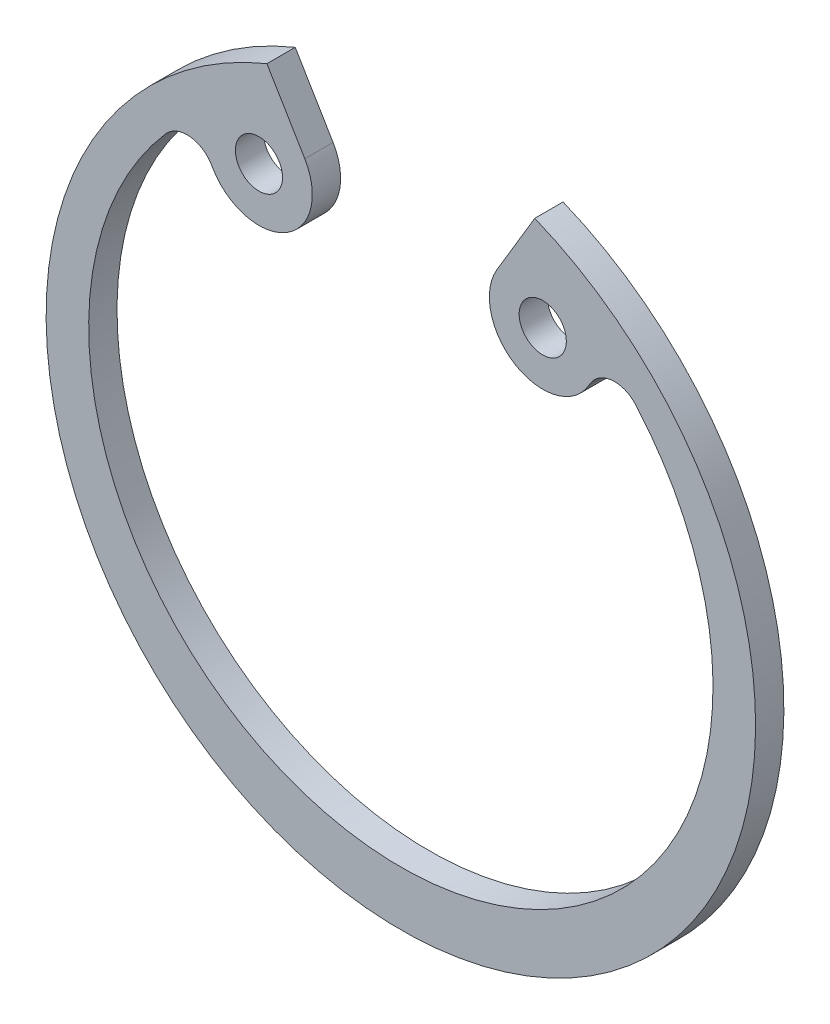
ISO-10303-21;
HEADER;
FILE_DESCRIPTION(('STEP AP214'),'2;1');
FILE_NAME('part.step','',(''),(''),'','','');
FILE_SCHEMA(('AUTOMOTIVE_DESIGN { 1 0 10303 214 1 1 1 1 }'));
ENDSEC;
DATA;
#1=APPLICATION_CONTEXT('core data for automotive mechanical design processes');
#2=APPLICATION_PROTOCOL_DEFINITION('international standard','automotive_design',2000,#1);
#3=PRODUCT_CONTEXT('',#1,'mechanical');
#4=PRODUCT('Part','Part','',(#3));
#5=PRODUCT_RELATED_PRODUCT_CATEGORY('part','',(#4));
#6=PRODUCT_DEFINITION_FORMATION('','',#4);
#7=PRODUCT_DEFINITION_CONTEXT('part definition',#1,'design');
#8=PRODUCT_DEFINITION('design','',#6,#7);
#9=PRODUCT_DEFINITION_SHAPE('','',#8);
#10=(LENGTH_UNIT() NAMED_UNIT(*) SI_UNIT(.MILLI.,.METRE.));
#11=(NAMED_UNIT(*) PLANE_ANGLE_UNIT() SI_UNIT($,.RADIAN.));
#12=(NAMED_UNIT(*) SI_UNIT($,.STERADIAN.) SOLID_ANGLE_UNIT());
#13=UNCERTAINTY_MEASURE_WITH_UNIT(LENGTH_MEASURE(1.E-05),#10,'distance_accuracy_value','');
#14=(GEOMETRIC_REPRESENTATION_CONTEXT(3) GLOBAL_UNCERTAINTY_ASSIGNED_CONTEXT((#13)) GLOBAL_UNIT_ASSIGNED_CONTEXT((#10,
#11,#12)) REPRESENTATION_CONTEXT('',''));
#15=CARTESIAN_POINT('',(0.,0.,0.));
#16=DIRECTION('',(0.,0.,1.));
#17=DIRECTION('',(1.,0.,0.));
#18=AXIS2_PLACEMENT_3D('',#15,#16,#17);
#19=CARTESIAN_POINT('',(-7.52,12.5979952696146,0.75));
#20=DIRECTION('',(0.,0.,-1.));
#21=DIRECTION('',(-1.,0.,0.));
#22=AXIS2_PLACEMENT_3D('',#19,#20,#21);
#23=PLANE('',#22);
#24=CARTESIAN_POINT('',(7.52,12.5979952696146,0.75));
#25=DIRECTION('',(0.,0.,1.));
#26=DIRECTION('',(1.,0.,0.));
#27=AXIS2_PLACEMENT_3D('',#24,#25,#26);
#28=CIRCLE('',#27,1.25);
#29=CARTESIAN_POINT('',(8.77,12.5979952696146,0.75));
#30=VERTEX_POINT('',#29);
#31=EDGE_CURVE('E179',#30,#30,#28,.T.);
#32=ORIENTED_EDGE('',*,*,#31,.F.);
#33=EDGE_LOOP('',(#32));
#34=FACE_BOUND('',#33,.T.);
#35=CARTESIAN_POINT('',(-7.52,12.5979952696146,0.75));
#36=DIRECTION('',(0.,0.,1.));
#37=DIRECTION('',(-1.,0.,0.));
#38=AXIS2_PLACEMENT_3D('',#35,#36,#37);
#39=CIRCLE('',#38,2.82826237921249);
#40=CARTESIAN_POINT('',(-9.94850826503776,11.1483692170369,0.75));
#41=VERTEX_POINT('',#40);
#42=CARTESIAN_POINT('',(-5.09149173496224,14.0476213221923,0.75));
#43=VERTEX_POINT('',#42);
#44=EDGE_CURVE('E123',#41,#43,#39,.T.);
#45=ORIENTED_EDGE('',*,*,#44,.T.);
#46=DIRECTION('',(-0.512550060147299,0.858657344837276,0.));
#47=VECTOR('',#46,1.);
#48=CARTESIAN_POINT('',(-7.09776833095385,17.4086669426498,0.75));
#49=LINE('',#48,#47);
#50=CARTESIAN_POINT('',(-7.09776833095385,17.4086669426498,0.75));
#51=VERTEX_POINT('',#50);
#52=EDGE_CURVE('E113',#43,#51,#49,.T.);
#53=ORIENTED_EDGE('',*,*,#52,.T.);
#54=CARTESIAN_POINT('',(0.,0.,0.75));
#55=DIRECTION('',(0.,0.,1.));
#56=DIRECTION('',(1.,0.,0.));
#57=AXIS2_PLACEMENT_3D('',#54,#55,#56);
#58=CIRCLE('',#57,18.8);
#59=CARTESIAN_POINT('',(7.09776833095385,17.4086669426498,0.75));
#60=VERTEX_POINT('',#59);
#61=EDGE_CURVE('E122',#51,#60,#58,.T.);
#62=ORIENTED_EDGE('',*,*,#61,.T.);
#63=DIRECTION('',(-0.512550060147299,-0.858657344837276,0.));
#64=VECTOR('',#63,1.);
#65=CARTESIAN_POINT('',(7.09776833095385,17.4086669426498,0.75));
#66=LINE('',#65,#64);
#67=CARTESIAN_POINT('',(5.09149173496224,14.0476213221923,0.75));
#68=VERTEX_POINT('',#67);
#69=EDGE_CURVE('E201',#60,#68,#66,.T.);
#70=ORIENTED_EDGE('',*,*,#69,.T.);
#71=CARTESIAN_POINT('',(7.52,12.5979952696146,0.75));
#72=DIRECTION('',(0.,0.,1.));
#73=DIRECTION('',(1.,0.,0.));
#74=AXIS2_PLACEMENT_3D('',#71,#72,#73);
#75=CIRCLE('',#74,2.82826237921249);
#76=CARTESIAN_POINT('',(9.94850826503776,11.1483692170369,0.75));
#77=VERTEX_POINT('',#76);
#78=EDGE_CURVE('E216',#68,#77,#75,.T.);
#79=ORIENTED_EDGE('',*,*,#78,.T.);
#80=DIRECTION('',(0.512550060147299,0.858657344837275,0.));
#81=VECTOR('',#80,1.);
#82=CARTESIAN_POINT('',(9.94850826503776,11.1483692170369,0.75));
#83=LINE('',#82,#81);
#84=CARTESIAN_POINT('',(10.037310489284,11.297136504402,0.75));
#85=VERTEX_POINT('',#84);
#86=EDGE_CURVE('E173',#77,#85,#83,.T.);
#87=ORIENTED_EDGE('',*,*,#86,.T.);
#88=CARTESIAN_POINT('',(11.32529650654,10.5283114141811,0.75));
#89=DIRECTION('',(0.,0.,-1.));
#90=DIRECTION('',(-1.,0.,0.));
#91=AXIS2_PLACEMENT_3D('',#88,#89,#90);
#92=CIRCLE('',#91,1.5);
#93=CARTESIAN_POINT('',(12.4545137865061,11.5156656234829,0.75));
#94=VERTEX_POINT('',#93);
#95=EDGE_CURVE('E152',#85,#94,#92,.T.);
#96=ORIENTED_EDGE('',*,*,#95,.T.);
#97=CARTESIAN_POINT('',(0.,0.625806931023615,0.75));
#98=DIRECTION('',(0.,0.,-1.));
#99=DIRECTION('',(1.,0.,0.));
#100=AXIS2_PLACEMENT_3D('',#97,#98,#99);
#101=CIRCLE('',#100,16.544);
#102=CARTESIAN_POINT('',(-12.4545137865061,11.5156656234829,0.75));
#103=VERTEX_POINT('',#102);
#104=EDGE_CURVE('E169',#94,#103,#101,.T.);
#105=ORIENTED_EDGE('',*,*,#104,.T.);
#106=CARTESIAN_POINT('',(-11.32529650654,10.5283114141811,0.75));
#107=DIRECTION('',(0.,0.,-1.));
#108=DIRECTION('',(-1.,0.,0.));
#109=AXIS2_PLACEMENT_3D('',#106,#107,#108);
#110=CIRCLE('',#109,1.5);
#111=CARTESIAN_POINT('',(-10.037310489284,11.297136504402,0.75));
#112=VERTEX_POINT('',#111);
#113=EDGE_CURVE('E11',#103,#112,#110,.T.);
#114=ORIENTED_EDGE('',*,*,#113,.T.);
#115=DIRECTION('',(0.512550060147299,-0.858657344837275,0.));
#116=VECTOR('',#115,1.);
#117=CARTESIAN_POINT('',(-9.94850826503776,11.1483692170369,0.75));
#118=LINE('',#117,#116);
#119=EDGE_CURVE('E127',#112,#41,#118,.T.);
#120=ORIENTED_EDGE('',*,*,#119,.T.);
#121=EDGE_LOOP('',(#45,#53,#62,#70,#79,#87,#96,#105,#114,#120));
#122=FACE_BOUND('',#121,.T.);
#123=CARTESIAN_POINT('',(-7.52,12.5979952696146,0.75));
#124=DIRECTION('',(0.,0.,1.));
#125=DIRECTION('',(-1.,0.,0.));
#126=AXIS2_PLACEMENT_3D('',#123,#124,#125);
#127=CIRCLE('',#126,1.25);
#128=CARTESIAN_POINT('',(-8.77,12.5979952696146,0.75));
#129=VERTEX_POINT('',#128);
#130=EDGE_CURVE('E224',#129,#129,#127,.T.);
#131=ORIENTED_EDGE('',*,*,#130,.F.);
#132=EDGE_LOOP('',(#131));
#133=FACE_BOUND('',#132,.T.);
#134=ADVANCED_FACE('F37',(#34,#122,#133),#23,.F.);
#135=CARTESIAN_POINT('',(-7.52,12.5979952696146,-0.75));
#136=DIRECTION('',(0.,0.,-1.));
#137=DIRECTION('',(-1.,0.,0.));
#138=AXIS2_PLACEMENT_3D('',#135,#136,#137);
#139=PLANE('',#138);
#140=CARTESIAN_POINT('',(7.52,12.5979952696146,-0.75));
#141=DIRECTION('',(0.,0.,1.));
#142=DIRECTION('',(1.,0.,0.));
#143=AXIS2_PLACEMENT_3D('',#140,#141,#142);
#144=CIRCLE('',#143,1.25);
#145=CARTESIAN_POINT('',(8.77,12.5979952696146,-0.75));
#146=VERTEX_POINT('',#145);
#147=EDGE_CURVE('E221',#146,#146,#144,.T.);
#148=ORIENTED_EDGE('',*,*,#147,.T.);
#149=EDGE_LOOP('',(#148));
#150=FACE_BOUND('',#149,.T.);
#151=CARTESIAN_POINT('',(-7.52,12.5979952696146,-0.75));
#152=DIRECTION('',(0.,0.,1.));
#153=DIRECTION('',(-1.,0.,0.));
#154=AXIS2_PLACEMENT_3D('',#151,#152,#153);
#155=CIRCLE('',#154,2.82826237921249);
#156=CARTESIAN_POINT('',(-9.94850826503776,11.1483692170369,-0.75));
#157=VERTEX_POINT('',#156);
#158=CARTESIAN_POINT('',(-5.09149173496224,14.0476213221923,-0.75));
#159=VERTEX_POINT('',#158);
#160=EDGE_CURVE('E135',#157,#159,#155,.T.);
#161=ORIENTED_EDGE('',*,*,#160,.F.);
#162=DIRECTION('',(0.512550060147299,-0.858657344837275,0.));
#163=VECTOR('',#162,1.);
#164=CARTESIAN_POINT('',(-9.94850826503776,11.1483692170369,-0.75));
#165=LINE('',#164,#163);
#166=CARTESIAN_POINT('',(-10.037310489284,11.297136504402,-0.75));
#167=VERTEX_POINT('',#166);
#168=EDGE_CURVE('E131',#167,#157,#165,.T.);
#169=ORIENTED_EDGE('',*,*,#168,.F.);
#170=CARTESIAN_POINT('',(-11.32529650654,10.5283114141811,-0.75));
#171=DIRECTION('',(0.,0.,-1.));
#172=DIRECTION('',(-1.,0.,0.));
#173=AXIS2_PLACEMENT_3D('',#170,#171,#172);
#174=CIRCLE('',#173,1.5);
#175=CARTESIAN_POINT('',(-12.4545137865061,11.5156656234829,-0.75));
#176=VERTEX_POINT('',#175);
#177=EDGE_CURVE('E45',#167,#176,#174,.F.);
#178=ORIENTED_EDGE('',*,*,#177,.T.);
#179=CARTESIAN_POINT('',(0.,0.625806931023615,-0.75));
#180=DIRECTION('',(0.,0.,-1.));
#181=DIRECTION('',(1.,0.,0.));
#182=AXIS2_PLACEMENT_3D('',#179,#180,#181);
#183=CIRCLE('',#182,16.544);
#184=CARTESIAN_POINT('',(12.4545137865061,11.5156656234829,-0.75));
#185=VERTEX_POINT('',#184);
#186=EDGE_CURVE('E159',#185,#176,#183,.T.);
#187=ORIENTED_EDGE('',*,*,#186,.F.);
#188=CARTESIAN_POINT('',(11.32529650654,10.5283114141811,-0.75));
#189=DIRECTION('',(0.,0.,-1.));
#190=DIRECTION('',(-1.,0.,0.));
#191=AXIS2_PLACEMENT_3D('',#188,#189,#190);
#192=CIRCLE('',#191,1.5);
#193=CARTESIAN_POINT('',(10.037310489284,11.297136504402,-0.75));
#194=VERTEX_POINT('',#193);
#195=EDGE_CURVE('E150',#185,#194,#192,.F.);
#196=ORIENTED_EDGE('',*,*,#195,.T.);
#197=DIRECTION('',(0.512550060147299,0.858657344837275,0.));
#198=VECTOR('',#197,1.);
#199=CARTESIAN_POINT('',(9.94850826503776,11.1483692170369,-0.75));
#200=LINE('',#199,#198);
#201=CARTESIAN_POINT('',(9.94850826503776,11.1483692170369,-0.75));
#202=VERTEX_POINT('',#201);
#203=EDGE_CURVE('E164',#202,#194,#200,.T.);
#204=ORIENTED_EDGE('',*,*,#203,.F.);
#205=CARTESIAN_POINT('',(7.52,12.5979952696146,-0.75));
#206=DIRECTION('',(0.,0.,1.));
#207=DIRECTION('',(1.,0.,0.));
#208=AXIS2_PLACEMENT_3D('',#205,#206,#207);
#209=CIRCLE('',#208,2.82826237921249);
#210=CARTESIAN_POINT('',(5.09149173496224,14.0476213221923,-0.75));
#211=VERTEX_POINT('',#210);
#212=EDGE_CURVE('E185',#211,#202,#209,.T.);
#213=ORIENTED_EDGE('',*,*,#212,.F.);
#214=DIRECTION('',(-0.512550060147299,-0.858657344837276,0.));
#215=VECTOR('',#214,1.);
#216=CARTESIAN_POINT('',(7.09776833095385,17.4086669426498,-0.75));
#217=LINE('',#216,#215);
#218=CARTESIAN_POINT('',(7.09776833095385,17.4086669426498,-0.75));
#219=VERTEX_POINT('',#218);
#220=EDGE_CURVE('E183',#219,#211,#217,.T.);
#221=ORIENTED_EDGE('',*,*,#220,.F.);
#222=CARTESIAN_POINT('',(0.,0.,-0.75));
#223=DIRECTION('',(0.,0.,1.));
#224=DIRECTION('',(1.,0.,0.));
#225=AXIS2_PLACEMENT_3D('',#222,#223,#224);
#226=CIRCLE('',#225,18.8);
#227=CARTESIAN_POINT('',(-7.09776833095385,17.4086669426498,-0.75));
#228=VERTEX_POINT('',#227);
#229=EDGE_CURVE('E181',#228,#219,#226,.T.);
#230=ORIENTED_EDGE('',*,*,#229,.F.);
#231=DIRECTION('',(-0.512550060147299,0.858657344837276,0.));
#232=VECTOR('',#231,1.);
#233=CARTESIAN_POINT('',(-7.09776833095385,17.4086669426498,-0.75));
#234=LINE('',#233,#232);
#235=EDGE_CURVE('E178',#159,#228,#234,.T.);
#236=ORIENTED_EDGE('',*,*,#235,.F.);
#237=EDGE_LOOP('',(#161,#169,#178,#187,#196,#204,#213,#221,#230,#236));
#238=FACE_BOUND('',#237,.T.);
#239=CARTESIAN_POINT('',(-7.52,12.5979952696146,-0.75));
#240=DIRECTION('',(0.,0.,1.));
#241=DIRECTION('',(-1.,0.,0.));
#242=AXIS2_PLACEMENT_3D('',#239,#240,#241);
#243=CIRCLE('',#242,1.25);
#244=CARTESIAN_POINT('',(-8.77,12.5979952696146,-0.75));
#245=VERTEX_POINT('',#244);
#246=EDGE_CURVE('E227',#245,#245,#243,.T.);
#247=ORIENTED_EDGE('',*,*,#246,.T.);
#248=EDGE_LOOP('',(#247));
#249=FACE_BOUND('',#248,.T.);
#250=ADVANCED_FACE('F157',(#150,#238,#249),#139,.T.);
#251=CARTESIAN_POINT('',(-7.52,12.5979952696146,0.75));
#252=DIRECTION('',(0.,0.,-1.));
#253=DIRECTION('',(-1.,0.,0.));
#254=AXIS2_PLACEMENT_3D('',#251,#252,#253);
#255=CYLINDRICAL_SURFACE('',#254,2.82826237921249);
#256=ORIENTED_EDGE('',*,*,#160,.T.);
#257=DIRECTION('',(0.,0.,-1.));
#258=VECTOR('',#257,1.);
#259=CARTESIAN_POINT('',(-5.09149173496224,14.0476213221923,0.75));
#260=LINE('',#259,#258);
#261=EDGE_CURVE('E117',#43,#159,#260,.T.);
#262=ORIENTED_EDGE('',*,*,#261,.F.);
#263=ORIENTED_EDGE('',*,*,#44,.F.);
#264=DIRECTION('',(0.,0.,-1.));
#265=VECTOR('',#264,1.);
#266=CARTESIAN_POINT('',(-9.94850826503776,11.1483692170369,0.75));
#267=LINE('',#266,#265);
#268=EDGE_CURVE('E168',#41,#157,#267,.T.);
#269=ORIENTED_EDGE('',*,*,#268,.T.);
#270=EDGE_LOOP('',(#256,#262,#263,#269));
#271=FACE_BOUND('',#270,.T.);
#272=ADVANCED_FACE('F133',(#271),#255,.T.);
#273=CARTESIAN_POINT('',(-7.09776833095385,17.4086669426498,0.75));
#274=DIRECTION('',(-0.858657344837276,-0.512550060147299,0.));
#275=DIRECTION('',(0.512550060147299,-0.858657344837276,0.));
#276=AXIS2_PLACEMENT_3D('',#273,#274,#275);
#277=PLANE('',#276);
#278=ORIENTED_EDGE('',*,*,#235,.T.);
#279=DIRECTION('',(0.,0.,-1.));
#280=VECTOR('',#279,1.);
#281=CARTESIAN_POINT('',(-7.09776833095385,17.4086669426498,0.75));
#282=LINE('',#281,#280);
#283=EDGE_CURVE('E120',#51,#228,#282,.T.);
#284=ORIENTED_EDGE('',*,*,#283,.F.);
#285=ORIENTED_EDGE('',*,*,#52,.F.);
#286=ORIENTED_EDGE('',*,*,#261,.T.);
#287=EDGE_LOOP('',(#278,#284,#285,#286));
#288=FACE_BOUND('',#287,.T.);
#289=ADVANCED_FACE('F115',(#288),#277,.F.);
#290=CARTESIAN_POINT('',(0.,0.,0.75));
#291=DIRECTION('',(0.,0.,-1.));
#292=DIRECTION('',(-1.,0.,0.));
#293=AXIS2_PLACEMENT_3D('',#290,#291,#292);
#294=CYLINDRICAL_SURFACE('',#293,18.8);
#295=ORIENTED_EDGE('',*,*,#229,.T.);
#296=DIRECTION('',(0.,0.,-1.));
#297=VECTOR('',#296,1.);
#298=CARTESIAN_POINT('',(7.09776833095385,17.4086669426498,0.75));
#299=LINE('',#298,#297);
#300=EDGE_CURVE('E140',#60,#219,#299,.T.);
#301=ORIENTED_EDGE('',*,*,#300,.F.);
#302=ORIENTED_EDGE('',*,*,#61,.F.);
#303=ORIENTED_EDGE('',*,*,#283,.T.);
#304=EDGE_LOOP('',(#295,#301,#302,#303));
#305=FACE_BOUND('',#304,.T.);
#306=ADVANCED_FACE('F258',(#305),#294,.T.);
#307=CARTESIAN_POINT('',(7.09776833095385,17.4086669426498,0.75));
#308=DIRECTION('',(0.858657344837276,-0.512550060147299,0.));
#309=DIRECTION('',(0.512550060147299,0.858657344837276,0.));
#310=AXIS2_PLACEMENT_3D('',#307,#308,#309);
#311=PLANE('',#310);
#312=ORIENTED_EDGE('',*,*,#220,.T.);
#313=DIRECTION('',(0.,0.,-1.));
#314=VECTOR('',#313,1.);
#315=CARTESIAN_POINT('',(5.09149173496224,14.0476213221923,0.75));
#316=LINE('',#315,#314);
#317=EDGE_CURVE('E192',#68,#211,#316,.T.);
#318=ORIENTED_EDGE('',*,*,#317,.F.);
#319=ORIENTED_EDGE('',*,*,#69,.F.);
#320=ORIENTED_EDGE('',*,*,#300,.T.);
#321=EDGE_LOOP('',(#312,#318,#319,#320));
#322=FACE_BOUND('',#321,.T.);
#323=ADVANCED_FACE('F199',(#322),#311,.F.);
#324=CARTESIAN_POINT('',(7.52,12.5979952696146,0.75));
#325=DIRECTION('',(0.,0.,-1.));
#326=DIRECTION('',(-1.,0.,0.));
#327=AXIS2_PLACEMENT_3D('',#324,#325,#326);
#328=CYLINDRICAL_SURFACE('',#327,2.82826237921249);
#329=ORIENTED_EDGE('',*,*,#212,.T.);
#330=DIRECTION('',(0.,0.,-1.));
#331=VECTOR('',#330,1.);
#332=CARTESIAN_POINT('',(9.94850826503776,11.1483692170369,0.75));
#333=LINE('',#332,#331);
#334=EDGE_CURVE('E171',#77,#202,#333,.T.);
#335=ORIENTED_EDGE('',*,*,#334,.F.);
#336=ORIENTED_EDGE('',*,*,#78,.F.);
#337=ORIENTED_EDGE('',*,*,#317,.T.);
#338=EDGE_LOOP('',(#329,#335,#336,#337));
#339=FACE_BOUND('',#338,.T.);
#340=ADVANCED_FACE('F208',(#339),#328,.T.);
#341=CARTESIAN_POINT('',(9.94850826503776,11.1483692170369,0.75));
#342=DIRECTION('',(-0.858657344837276,0.512550060147299,0.));
#343=DIRECTION('',(-0.512550060147299,-0.858657344837276,0.));
#344=AXIS2_PLACEMENT_3D('',#341,#342,#343);
#345=PLANE('',#344);
#346=ORIENTED_EDGE('',*,*,#203,.T.);
#347=DIRECTION('',(0.,0.,1.));
#348=VECTOR('',#347,1.);
#349=CARTESIAN_POINT('',(10.037310489284,11.297136504402,0.75));
#350=LINE('',#349,#348);
#351=EDGE_CURVE('E146',#194,#85,#350,.T.);
#352=ORIENTED_EDGE('',*,*,#351,.T.);
#353=ORIENTED_EDGE('',*,*,#86,.F.);
#354=ORIENTED_EDGE('',*,*,#334,.T.);
#355=EDGE_LOOP('',(#346,#352,#353,#354));
#356=FACE_BOUND('',#355,.T.);
#357=ADVANCED_FACE('F212',(#356),#345,.F.);
#358=CARTESIAN_POINT('',(0.,0.625806931023615,0.75));
#359=DIRECTION('',(0.,0.,-1.));
#360=DIRECTION('',(-1.,0.,0.));
#361=AXIS2_PLACEMENT_3D('',#358,#359,#360);
#362=CYLINDRICAL_SURFACE('',#361,16.544);
#363=ORIENTED_EDGE('',*,*,#104,.F.);
#364=DIRECTION('',(0.,0.,-1.));
#365=VECTOR('',#364,1.);
#366=CARTESIAN_POINT('',(12.4545137865061,11.5156656234829,0.75));
#367=LINE('',#366,#365);
#368=EDGE_CURVE('E138',#94,#185,#367,.T.);
#369=ORIENTED_EDGE('',*,*,#368,.T.);
#370=ORIENTED_EDGE('',*,*,#186,.T.);
#371=DIRECTION('',(0.,0.,-1.));
#372=VECTOR('',#371,1.);
#373=CARTESIAN_POINT('',(-12.4545137865061,11.5156656234829,0.75));
#374=LINE('',#373,#372);
#375=EDGE_CURVE('E136',#176,#103,#374,.F.);
#376=ORIENTED_EDGE('',*,*,#375,.T.);
#377=EDGE_LOOP('',(#363,#369,#370,#376));
#378=FACE_BOUND('',#377,.T.);
#379=ADVANCED_FACE('F162',(#378),#362,.F.);
#380=CARTESIAN_POINT('',(-9.94850826503776,11.1483692170369,0.75));
#381=DIRECTION('',(0.858657344837276,0.512550060147299,0.));
#382=DIRECTION('',(-0.512550060147299,0.858657344837276,0.));
#383=AXIS2_PLACEMENT_3D('',#380,#381,#382);
#384=PLANE('',#383);
#385=ORIENTED_EDGE('',*,*,#119,.F.);
#386=DIRECTION('',(0.,0.,1.));
#387=VECTOR('',#386,1.);
#388=CARTESIAN_POINT('',(-10.037310489284,11.297136504402,-0.75));
#389=LINE('',#388,#387);
#390=EDGE_CURVE('E148',#112,#167,#389,.F.);
#391=ORIENTED_EDGE('',*,*,#390,.T.);
#392=ORIENTED_EDGE('',*,*,#168,.T.);
#393=ORIENTED_EDGE('',*,*,#268,.F.);
#394=EDGE_LOOP('',(#385,#391,#392,#393));
#395=FACE_BOUND('',#394,.T.);
#396=ADVANCED_FACE('F167',(#395),#384,.F.);
#397=CARTESIAN_POINT('',(7.52,12.5979952696146,0.75));
#398=DIRECTION('',(0.,0.,-1.));
#399=DIRECTION('',(-1.,0.,0.));
#400=AXIS2_PLACEMENT_3D('',#397,#398,#399);
#401=CYLINDRICAL_SURFACE('',#400,1.25);
#402=ORIENTED_EDGE('',*,*,#31,.T.);
#403=EDGE_LOOP('',(#402));
#404=FACE_BOUND('',#403,.T.);
#405=ORIENTED_EDGE('',*,*,#147,.F.);
#406=EDGE_LOOP('',(#405));
#407=FACE_BOUND('',#406,.T.);
#408=ADVANCED_FACE('F245',(#404,#407),#401,.F.);
#409=CARTESIAN_POINT('',(-7.52,12.5979952696146,0.75));
#410=DIRECTION('',(0.,0.,-1.));
#411=DIRECTION('',(-1.,0.,0.));
#412=AXIS2_PLACEMENT_3D('',#409,#410,#411);
#413=CYLINDRICAL_SURFACE('',#412,1.25);
#414=ORIENTED_EDGE('',*,*,#130,.T.);
#415=EDGE_LOOP('',(#414));
#416=FACE_BOUND('',#415,.T.);
#417=ORIENTED_EDGE('',*,*,#246,.F.);
#418=EDGE_LOOP('',(#417));
#419=FACE_BOUND('',#418,.T.);
#420=ADVANCED_FACE('F233',(#416,#419),#413,.F.);
#421=CARTESIAN_POINT('',(11.32529650654,10.5283114141811,0.75));
#422=DIRECTION('',(0.,0.,-1.));
#423=DIRECTION('',(-1.,0.,0.));
#424=AXIS2_PLACEMENT_3D('',#421,#422,#423);
#425=CYLINDRICAL_SURFACE('',#424,1.5);
#426=ORIENTED_EDGE('',*,*,#95,.F.);
#427=ORIENTED_EDGE('',*,*,#351,.F.);
#428=ORIENTED_EDGE('',*,*,#195,.F.);
#429=ORIENTED_EDGE('',*,*,#368,.F.);
#430=EDGE_LOOP('',(#426,#427,#428,#429));
#431=FACE_BOUND('',#430,.T.);
#432=ADVANCED_FACE('F264',(#431),#425,.F.);
#433=CARTESIAN_POINT('',(-11.32529650654,10.5283114141811,0.75));
#434=DIRECTION('',(0.,0.,-1.));
#435=DIRECTION('',(-1.,0.,0.));
#436=AXIS2_PLACEMENT_3D('',#433,#434,#435);
#437=CYLINDRICAL_SURFACE('',#436,1.5);
#438=ORIENTED_EDGE('',*,*,#113,.F.);
#439=ORIENTED_EDGE('',*,*,#375,.F.);
#440=ORIENTED_EDGE('',*,*,#177,.F.);
#441=ORIENTED_EDGE('',*,*,#390,.F.);
#442=EDGE_LOOP('',(#438,#439,#440,#441));
#443=FACE_BOUND('',#442,.T.);
#444=ADVANCED_FACE('F39',(#443),#437,.F.);
#445=CLOSED_SHELL('',(#134,#250,#272,#289,#306,#323,#340,#357,#379,#396,#408,#420,#432,#444));
#446=MANIFOLD_SOLID_BREP('B2',#445);
#447=ADVANCED_BREP_SHAPE_REPRESENTATION('',(#18,#446),#14);
#448=SHAPE_DEFINITION_REPRESENTATION(#9,#447);
ENDSEC;
END-ISO-10303-21;
